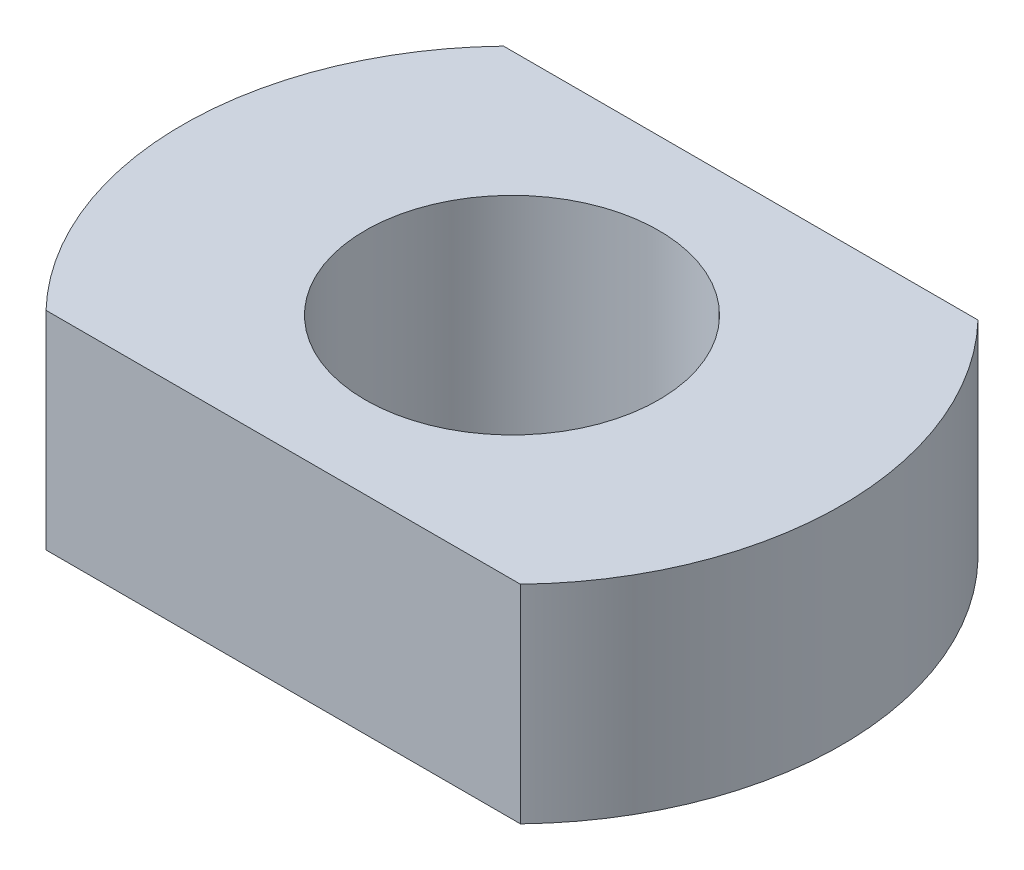
ISO-10303-21;
HEADER;
FILE_DESCRIPTION(('STEP AP214'),'2;1');
FILE_NAME('part.step','',(''),(''),'','','');
FILE_SCHEMA(('AUTOMOTIVE_DESIGN { 1 0 10303 214 1 1 1 1 }'));
ENDSEC;
DATA;
#1=APPLICATION_CONTEXT('core data for automotive mechanical design processes');
#2=APPLICATION_PROTOCOL_DEFINITION('international standard','automotive_design',2000,#1);
#3=PRODUCT_CONTEXT('',#1,'mechanical');
#4=PRODUCT('Part','Part','',(#3));
#5=PRODUCT_RELATED_PRODUCT_CATEGORY('part','',(#4));
#6=PRODUCT_DEFINITION_FORMATION('','',#4);
#7=PRODUCT_DEFINITION_CONTEXT('part definition',#1,'design');
#8=PRODUCT_DEFINITION('design','',#6,#7);
#9=PRODUCT_DEFINITION_SHAPE('','',#8);
#10=(LENGTH_UNIT() NAMED_UNIT(*) SI_UNIT(.MILLI.,.METRE.));
#11=(NAMED_UNIT(*) PLANE_ANGLE_UNIT() SI_UNIT($,.RADIAN.));
#12=(NAMED_UNIT(*) SI_UNIT($,.STERADIAN.) SOLID_ANGLE_UNIT());
#13=UNCERTAINTY_MEASURE_WITH_UNIT(LENGTH_MEASURE(1.E-05),#10,'distance_accuracy_value','');
#14=(GEOMETRIC_REPRESENTATION_CONTEXT(3) GLOBAL_UNCERTAINTY_ASSIGNED_CONTEXT((#13)) GLOBAL_UNIT_ASSIGNED_CONTEXT((#10,
#11,#12)) REPRESENTATION_CONTEXT('',''));
#15=CARTESIAN_POINT('',(0.,0.,0.));
#16=DIRECTION('',(0.,0.,1.));
#17=DIRECTION('',(1.,0.,0.));
#18=AXIS2_PLACEMENT_3D('',#15,#16,#17);
#19=CARTESIAN_POINT('',(0.,7.,0.));
#20=DIRECTION('',(0.,-1.,0.));
#21=DIRECTION('',(0.,0.,-1.));
#22=AXIS2_PLACEMENT_3D('',#19,#20,#21);
#23=CYLINDRICAL_SURFACE('',#22,11.115);
#24=CARTESIAN_POINT('',(0.,0.,0.));
#25=DIRECTION('',(0.,1.,0.));
#26=DIRECTION('',(0.,0.,1.));
#27=AXIS2_PLACEMENT_3D('',#24,#25,#26);
#28=CIRCLE('',#27,11.115);
#29=CARTESIAN_POINT('',(8.,0.,7.71642566218324));
#30=VERTEX_POINT('',#29);
#31=CARTESIAN_POINT('',(8.,0.,-7.71642566218324));
#32=VERTEX_POINT('',#31);
#33=EDGE_CURVE('E116',#30,#32,#28,.T.);
#34=ORIENTED_EDGE('',*,*,#33,.T.);
#35=DIRECTION('',(0.,-1.,0.));
#36=VECTOR('',#35,1.);
#37=CARTESIAN_POINT('',(8.,7.,-7.71642566218324));
#38=LINE('',#37,#36);
#39=CARTESIAN_POINT('',(8.,7.,-7.71642566218324));
#40=VERTEX_POINT('',#39);
#41=EDGE_CURVE('E11',#40,#32,#38,.T.);
#42=ORIENTED_EDGE('',*,*,#41,.F.);
#43=CARTESIAN_POINT('',(0.,7.,0.));
#44=DIRECTION('',(0.,1.,0.));
#45=DIRECTION('',(0.,0.,1.));
#46=AXIS2_PLACEMENT_3D('',#43,#44,#45);
#47=CIRCLE('',#46,11.115);
#48=CARTESIAN_POINT('',(8.,7.,7.71642566218324));
#49=VERTEX_POINT('',#48);
#50=EDGE_CURVE('E84',#49,#40,#47,.T.);
#51=ORIENTED_EDGE('',*,*,#50,.F.);
#52=DIRECTION('',(0.,-1.,0.));
#53=VECTOR('',#52,1.);
#54=CARTESIAN_POINT('',(8.,7.,7.71642566218324));
#55=LINE('',#54,#53);
#56=EDGE_CURVE('E115',#49,#30,#55,.T.);
#57=ORIENTED_EDGE('',*,*,#56,.T.);
#58=EDGE_LOOP('',(#34,#42,#51,#57));
#59=FACE_BOUND('',#58,.T.);
#60=ADVANCED_FACE('F41',(#59),#23,.T.);
#61=CARTESIAN_POINT('',(0.,7.,-7.71642566218324));
#62=DIRECTION('',(0.,0.,-1.));
#63=DIRECTION('',(-1.,0.,0.));
#64=AXIS2_PLACEMENT_3D('',#61,#62,#63);
#65=PLANE('',#64);
#66=DIRECTION('',(1.,0.,0.));
#67=VECTOR('',#66,1.);
#68=CARTESIAN_POINT('',(0.,0.,-7.71642566218324));
#69=LINE('',#68,#67);
#70=CARTESIAN_POINT('',(-8.,0.,-7.71642566218324));
#71=VERTEX_POINT('',#70);
#72=EDGE_CURVE('E94',#71,#32,#69,.T.);
#73=ORIENTED_EDGE('',*,*,#72,.F.);
#74=DIRECTION('',(0.,-1.,0.));
#75=VECTOR('',#74,1.);
#76=CARTESIAN_POINT('',(-8.,7.,-7.71642566218324));
#77=LINE('',#76,#75);
#78=CARTESIAN_POINT('',(-8.,7.,-7.71642566218324));
#79=VERTEX_POINT('',#78);
#80=EDGE_CURVE('E50',#79,#71,#77,.T.);
#81=ORIENTED_EDGE('',*,*,#80,.F.);
#82=DIRECTION('',(1.,0.,0.));
#83=VECTOR('',#82,1.);
#84=CARTESIAN_POINT('',(0.,7.,-7.71642566218324));
#85=LINE('',#84,#83);
#86=EDGE_CURVE('E92',#79,#40,#85,.T.);
#87=ORIENTED_EDGE('',*,*,#86,.T.);
#88=ORIENTED_EDGE('',*,*,#41,.T.);
#89=EDGE_LOOP('',(#73,#81,#87,#88));
#90=FACE_BOUND('',#89,.T.);
#91=ADVANCED_FACE('F91',(#90),#65,.T.);
#92=CARTESIAN_POINT('',(0.,7.,0.));
#93=DIRECTION('',(0.,-1.,0.));
#94=DIRECTION('',(0.,0.,-1.));
#95=AXIS2_PLACEMENT_3D('',#92,#93,#94);
#96=CYLINDRICAL_SURFACE('',#95,11.115);
#97=CARTESIAN_POINT('',(0.,0.,0.));
#98=DIRECTION('',(0.,1.,0.));
#99=DIRECTION('',(0.,0.,1.));
#100=AXIS2_PLACEMENT_3D('',#97,#98,#99);
#101=CIRCLE('',#100,11.115);
#102=CARTESIAN_POINT('',(-8.,0.,7.71642566218324));
#103=VERTEX_POINT('',#102);
#104=EDGE_CURVE('E73',#71,#103,#101,.T.);
#105=ORIENTED_EDGE('',*,*,#104,.T.);
#106=DIRECTION('',(0.,-1.,0.));
#107=VECTOR('',#106,1.);
#108=CARTESIAN_POINT('',(-8.,7.,7.71642566218324));
#109=LINE('',#108,#107);
#110=CARTESIAN_POINT('',(-8.,7.,7.71642566218324));
#111=VERTEX_POINT('',#110);
#112=EDGE_CURVE('E96',#111,#103,#109,.T.);
#113=ORIENTED_EDGE('',*,*,#112,.F.);
#114=CARTESIAN_POINT('',(0.,7.,0.));
#115=DIRECTION('',(0.,1.,0.));
#116=DIRECTION('',(0.,0.,1.));
#117=AXIS2_PLACEMENT_3D('',#114,#115,#116);
#118=CIRCLE('',#117,11.115);
#119=EDGE_CURVE('E97',#79,#111,#118,.T.);
#120=ORIENTED_EDGE('',*,*,#119,.F.);
#121=ORIENTED_EDGE('',*,*,#80,.T.);
#122=EDGE_LOOP('',(#105,#113,#120,#121));
#123=FACE_BOUND('',#122,.T.);
#124=ADVANCED_FACE('F98',(#123),#96,.T.);
#125=CARTESIAN_POINT('',(0.,7.,7.71642566218324));
#126=DIRECTION('',(0.,0.,-1.));
#127=DIRECTION('',(-1.,0.,0.));
#128=AXIS2_PLACEMENT_3D('',#125,#126,#127);
#129=PLANE('',#128);
#130=DIRECTION('',(1.,0.,0.));
#131=VECTOR('',#130,1.);
#132=CARTESIAN_POINT('',(0.,0.,7.71642566218324));
#133=LINE('',#132,#131);
#134=EDGE_CURVE('E79',#103,#30,#133,.T.);
#135=ORIENTED_EDGE('',*,*,#134,.T.);
#136=ORIENTED_EDGE('',*,*,#56,.F.);
#137=DIRECTION('',(1.,0.,0.));
#138=VECTOR('',#137,1.);
#139=CARTESIAN_POINT('',(0.,7.,7.71642566218324));
#140=LINE('',#139,#138);
#141=EDGE_CURVE('E58',#111,#49,#140,.T.);
#142=ORIENTED_EDGE('',*,*,#141,.F.);
#143=ORIENTED_EDGE('',*,*,#112,.T.);
#144=EDGE_LOOP('',(#135,#136,#142,#143));
#145=FACE_BOUND('',#144,.T.);
#146=ADVANCED_FACE('F132',(#145),#129,.F.);
#147=CARTESIAN_POINT('',(0.,7.,0.));
#148=DIRECTION('',(0.,-1.,0.));
#149=DIRECTION('',(0.,0.,-1.));
#150=AXIS2_PLACEMENT_3D('',#147,#148,#149);
#151=CYLINDRICAL_SURFACE('',#150,4.95);
#152=CARTESIAN_POINT('',(0.,7.,0.));
#153=DIRECTION('',(0.,1.,0.));
#154=DIRECTION('',(0.,0.,1.));
#155=AXIS2_PLACEMENT_3D('',#152,#153,#154);
#156=CIRCLE('',#155,4.95);
#157=CARTESIAN_POINT('',(0.,7.,4.95));
#158=VERTEX_POINT('',#157);
#159=EDGE_CURVE('E111',#158,#158,#156,.T.);
#160=ORIENTED_EDGE('',*,*,#159,.T.);
#161=EDGE_LOOP('',(#160));
#162=FACE_BOUND('',#161,.T.);
#163=CARTESIAN_POINT('',(0.,0.,0.));
#164=DIRECTION('',(0.,1.,0.));
#165=DIRECTION('',(0.,0.,1.));
#166=AXIS2_PLACEMENT_3D('',#163,#164,#165);
#167=CIRCLE('',#166,4.95);
#168=CARTESIAN_POINT('',(0.,0.,4.95));
#169=VERTEX_POINT('',#168);
#170=EDGE_CURVE('E106',#169,#169,#167,.T.);
#171=ORIENTED_EDGE('',*,*,#170,.F.);
#172=EDGE_LOOP('',(#171));
#173=FACE_BOUND('',#172,.T.);
#174=ADVANCED_FACE('F149',(#162,#173),#151,.F.);
#175=CARTESIAN_POINT('',(0.,7.,0.));
#176=DIRECTION('',(0.,1.,0.));
#177=DIRECTION('',(0.,0.,1.));
#178=AXIS2_PLACEMENT_3D('',#175,#176,#177);
#179=PLANE('',#178);
#180=ORIENTED_EDGE('',*,*,#50,.T.);
#181=ORIENTED_EDGE('',*,*,#86,.F.);
#182=ORIENTED_EDGE('',*,*,#119,.T.);
#183=ORIENTED_EDGE('',*,*,#141,.T.);
#184=EDGE_LOOP('',(#180,#181,#182,#183));
#185=FACE_BOUND('',#184,.T.);
#186=ORIENTED_EDGE('',*,*,#159,.F.);
#187=EDGE_LOOP('',(#186));
#188=FACE_BOUND('',#187,.T.);
#189=ADVANCED_FACE('F101',(#185,#188),#179,.T.);
#190=CARTESIAN_POINT('',(0.,0.,0.));
#191=DIRECTION('',(0.,1.,0.));
#192=DIRECTION('',(0.,0.,1.));
#193=AXIS2_PLACEMENT_3D('',#190,#191,#192);
#194=PLANE('',#193);
#195=ORIENTED_EDGE('',*,*,#33,.F.);
#196=ORIENTED_EDGE('',*,*,#134,.F.);
#197=ORIENTED_EDGE('',*,*,#104,.F.);
#198=ORIENTED_EDGE('',*,*,#72,.T.);
#199=EDGE_LOOP('',(#195,#196,#197,#198));
#200=FACE_BOUND('',#199,.T.);
#201=ORIENTED_EDGE('',*,*,#170,.T.);
#202=EDGE_LOOP('',(#201));
#203=FACE_BOUND('',#202,.T.);
#204=ADVANCED_FACE('F135',(#200,#203),#194,.F.);
#205=CLOSED_SHELL('',(#60,#91,#124,#146,#174,#189,#204));
#206=MANIFOLD_SOLID_BREP('B2',#205);
#207=ADVANCED_BREP_SHAPE_REPRESENTATION('',(#18,#206),#14);
#208=SHAPE_DEFINITION_REPRESENTATION(#9,#207);
ENDSEC;
END-ISO-10303-21;
